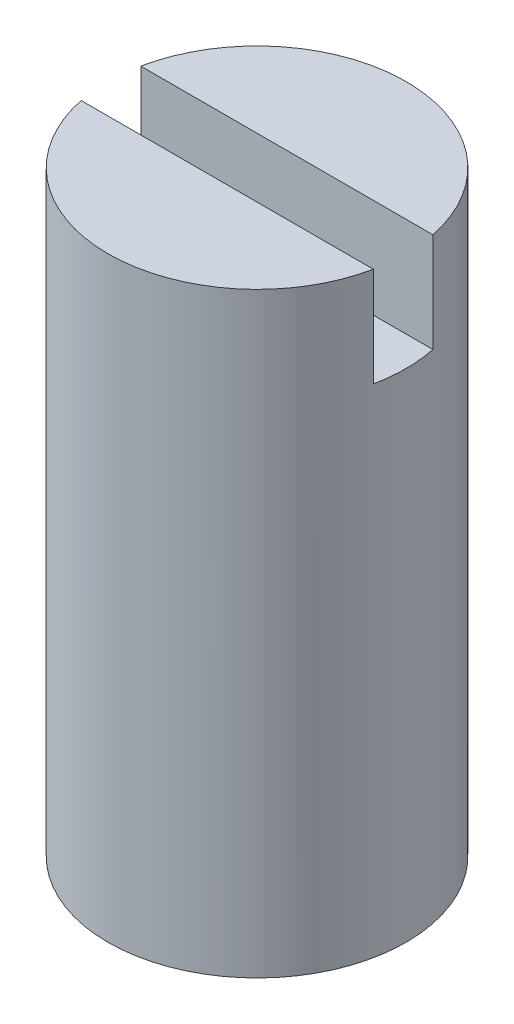
ISO-10303-21;
HEADER;
FILE_DESCRIPTION(('STEP AP214'),'2;1');
FILE_NAME('part.step','',(''),(''),'','','');
FILE_SCHEMA(('AUTOMOTIVE_DESIGN { 1 0 10303 214 1 1 1 1 }'));
ENDSEC;
DATA;
#1=APPLICATION_CONTEXT('core data for automotive mechanical design processes');
#2=APPLICATION_PROTOCOL_DEFINITION('international standard','automotive_design',2000,#1);
#3=PRODUCT_CONTEXT('',#1,'mechanical');
#4=PRODUCT('Part','Part','',(#3));
#5=PRODUCT_RELATED_PRODUCT_CATEGORY('part','',(#4));
#6=PRODUCT_DEFINITION_FORMATION('','',#4);
#7=PRODUCT_DEFINITION_CONTEXT('part definition',#1,'design');
#8=PRODUCT_DEFINITION('design','',#6,#7);
#9=PRODUCT_DEFINITION_SHAPE('','',#8);
#10=(LENGTH_UNIT() NAMED_UNIT(*) SI_UNIT(.MILLI.,.METRE.));
#11=(NAMED_UNIT(*) PLANE_ANGLE_UNIT() SI_UNIT($,.RADIAN.));
#12=(NAMED_UNIT(*) SI_UNIT($,.STERADIAN.) SOLID_ANGLE_UNIT());
#13=UNCERTAINTY_MEASURE_WITH_UNIT(LENGTH_MEASURE(1.E-05),#10,'distance_accuracy_value','');
#14=(GEOMETRIC_REPRESENTATION_CONTEXT(3) GLOBAL_UNCERTAINTY_ASSIGNED_CONTEXT((#13)) GLOBAL_UNIT_ASSIGNED_CONTEXT((#10,
#11,#12)) REPRESENTATION_CONTEXT('',''));
#15=CARTESIAN_POINT('',(0.,0.,0.));
#16=DIRECTION('',(0.,0.,1.));
#17=DIRECTION('',(1.,0.,0.));
#18=AXIS2_PLACEMENT_3D('',#15,#16,#17);
#19=CARTESIAN_POINT('',(0.,0.,0.));
#20=DIRECTION('',(0.,1.,0.));
#21=DIRECTION('',(0.,0.,1.));
#22=AXIS2_PLACEMENT_3D('',#19,#20,#21);
#23=PLANE('',#22);
#24=DIRECTION('',(-1.,0.,0.));
#25=VECTOR('',#24,1.);
#26=CARTESIAN_POINT('',(0.,0.,-0.952500000000001));
#27=LINE('',#26,#25);
#28=CARTESIAN_POINT('',(4.66627796000195,0.,-0.952500000000002));
#29=VERTEX_POINT('',#28);
#30=CARTESIAN_POINT('',(-4.66627796000195,0.,-0.9525));
#31=VERTEX_POINT('',#30);
#32=EDGE_CURVE('E82',#29,#31,#27,.T.);
#33=ORIENTED_EDGE('',*,*,#32,.F.);
#34=CARTESIAN_POINT('',(0.,0.,0.));
#35=DIRECTION('',(0.,1.,0.));
#36=DIRECTION('',(0.,0.,1.));
#37=AXIS2_PLACEMENT_3D('',#34,#35,#36);
#38=CIRCLE('',#37,4.7625);
#39=EDGE_CURVE('E91',#29,#31,#38,.T.);
#40=ORIENTED_EDGE('',*,*,#39,.T.);
#41=EDGE_LOOP('',(#33,#40));
#42=FACE_BOUND('',#41,.T.);
#43=ADVANCED_FACE('F36',(#42),#23,.T.);
#44=CARTESIAN_POINT('',(0.,-19.05,0.));
#45=DIRECTION('',(0.,1.,0.));
#46=DIRECTION('',(0.,0.,1.));
#47=AXIS2_PLACEMENT_3D('',#44,#45,#46);
#48=CYLINDRICAL_SURFACE('',#47,4.7625);
#49=DIRECTION('',(0.,1.,0.));
#50=VECTOR('',#49,1.);
#51=CARTESIAN_POINT('',(-4.66627796000195,-19.05,-0.9525));
#52=LINE('',#51,#50);
#53=CARTESIAN_POINT('',(-4.66627796000195,-3.175,-0.9525));
#54=VERTEX_POINT('',#53);
#55=EDGE_CURVE('E92',#31,#54,#52,.F.);
#56=ORIENTED_EDGE('',*,*,#55,.F.);
#57=ORIENTED_EDGE('',*,*,#39,.F.);
#58=DIRECTION('',(0.,1.,0.));
#59=VECTOR('',#58,1.);
#60=CARTESIAN_POINT('',(4.66627796000195,-19.05,-0.952500000000002));
#61=LINE('',#60,#59);
#62=CARTESIAN_POINT('',(4.66627796000195,-3.175,-0.952500000000002));
#63=VERTEX_POINT('',#62);
#64=EDGE_CURVE('E88',#63,#29,#61,.T.);
#65=ORIENTED_EDGE('',*,*,#64,.F.);
#66=CARTESIAN_POINT('',(0.,-3.175,0.));
#67=DIRECTION('',(0.,-1.,0.));
#68=DIRECTION('',(0.,0.,-1.));
#69=AXIS2_PLACEMENT_3D('',#66,#67,#68);
#70=CIRCLE('',#69,4.7625);
#71=CARTESIAN_POINT('',(4.66627796000195,-3.175,0.952499999999998));
#72=VERTEX_POINT('',#71);
#73=EDGE_CURVE('E40',#72,#63,#70,.F.);
#74=ORIENTED_EDGE('',*,*,#73,.F.);
#75=DIRECTION('',(0.,1.,0.));
#76=VECTOR('',#75,1.);
#77=CARTESIAN_POINT('',(4.66627796000195,-19.05,0.952499999999998));
#78=LINE('',#77,#76);
#79=CARTESIAN_POINT('',(4.66627796000195,0.,0.952499999999998));
#80=VERTEX_POINT('',#79);
#81=EDGE_CURVE('E77',#80,#72,#78,.F.);
#82=ORIENTED_EDGE('',*,*,#81,.F.);
#83=CARTESIAN_POINT('',(-4.66627796000195,0.,0.9525));
#84=VERTEX_POINT('',#83);
#85=EDGE_CURVE('E86',#84,#80,#38,.T.);
#86=ORIENTED_EDGE('',*,*,#85,.F.);
#87=DIRECTION('',(0.,1.,0.));
#88=VECTOR('',#87,1.);
#89=CARTESIAN_POINT('',(-4.66627796000195,-19.05,0.9525));
#90=LINE('',#89,#88);
#91=CARTESIAN_POINT('',(-4.66627796000195,-3.175,0.9525));
#92=VERTEX_POINT('',#91);
#93=EDGE_CURVE('E51',#92,#84,#90,.T.);
#94=ORIENTED_EDGE('',*,*,#93,.F.);
#95=EDGE_CURVE('E11',#54,#92,#70,.F.);
#96=ORIENTED_EDGE('',*,*,#95,.F.);
#97=EDGE_LOOP('',(#56,#57,#65,#74,#82,#86,#94,#96));
#98=FACE_BOUND('',#97,.T.);
#99=CARTESIAN_POINT('',(0.,-19.05,0.));
#100=DIRECTION('',(0.,1.,0.));
#101=DIRECTION('',(0.,0.,1.));
#102=AXIS2_PLACEMENT_3D('',#99,#100,#101);
#103=CIRCLE('',#102,4.7625);
#104=CARTESIAN_POINT('',(0.,-19.05,4.7625));
#105=VERTEX_POINT('',#104);
#106=EDGE_CURVE('E83',#105,#105,#103,.T.);
#107=ORIENTED_EDGE('',*,*,#106,.T.);
#108=EDGE_LOOP('',(#107));
#109=FACE_BOUND('',#108,.T.);
#110=ADVANCED_FACE('F38',(#98,#109),#48,.T.);
#111=CARTESIAN_POINT('',(0.,-19.05,0.));
#112=DIRECTION('',(0.,1.,0.));
#113=DIRECTION('',(0.,0.,1.));
#114=AXIS2_PLACEMENT_3D('',#111,#112,#113);
#115=PLANE('',#114);
#116=CARTESIAN_POINT('',(0.,-19.05,0.));
#117=DIRECTION('',(0.,-1.,0.));
#118=DIRECTION('',(0.,0.,-1.));
#119=AXIS2_PLACEMENT_3D('',#116,#117,#118);
#120=CIRCLE('',#119,2.);
#121=CARTESIAN_POINT('',(0.,-19.05,-2.));
#122=VERTEX_POINT('',#121);
#123=EDGE_CURVE('E113',#122,#122,#120,.T.);
#124=ORIENTED_EDGE('',*,*,#123,.F.);
#125=EDGE_LOOP('',(#124));
#126=FACE_BOUND('',#125,.T.);
#127=ORIENTED_EDGE('',*,*,#106,.F.);
#128=EDGE_LOOP('',(#127));
#129=FACE_BOUND('',#128,.T.);
#130=ADVANCED_FACE('F127',(#126,#129),#115,.F.);
#131=DIRECTION('',(1.,0.,0.));
#132=VECTOR('',#131,1.);
#133=CARTESIAN_POINT('',(0.,0.,0.952499999999999));
#134=LINE('',#133,#132);
#135=EDGE_CURVE('E74',#84,#80,#134,.T.);
#136=ORIENTED_EDGE('',*,*,#135,.F.);
#137=ORIENTED_EDGE('',*,*,#85,.T.);
#138=EDGE_LOOP('',(#136,#137));
#139=FACE_BOUND('',#138,.T.);
#140=ADVANCED_FACE('F90',(#139),#23,.T.);
#141=CARTESIAN_POINT('',(4.7625,-3.175,-0.952500000000002));
#142=DIRECTION('',(0.,0.,-1.));
#143=DIRECTION('',(-1.,0.,0.));
#144=AXIS2_PLACEMENT_3D('',#141,#142,#143);
#145=PLANE('',#144);
#146=ORIENTED_EDGE('',*,*,#55,.T.);
#147=DIRECTION('',(-1.,0.,0.));
#148=VECTOR('',#147,1.);
#149=CARTESIAN_POINT('',(4.7625,-3.175,-0.952500000000002));
#150=LINE('',#149,#148);
#151=EDGE_CURVE('E103',#63,#54,#150,.T.);
#152=ORIENTED_EDGE('',*,*,#151,.F.);
#153=ORIENTED_EDGE('',*,*,#64,.T.);
#154=ORIENTED_EDGE('',*,*,#32,.T.);
#155=EDGE_LOOP('',(#146,#152,#153,#154));
#156=FACE_BOUND('',#155,.T.);
#157=ADVANCED_FACE('F105',(#156),#145,.F.);
#158=CARTESIAN_POINT('',(4.7625,-3.175,0.952499999999998));
#159=DIRECTION('',(0.,0.,1.));
#160=DIRECTION('',(1.,0.,0.));
#161=AXIS2_PLACEMENT_3D('',#158,#159,#160);
#162=PLANE('',#161);
#163=ORIENTED_EDGE('',*,*,#81,.T.);
#164=DIRECTION('',(1.,0.,0.));
#165=VECTOR('',#164,1.);
#166=CARTESIAN_POINT('',(4.7625,-3.175,0.952499999999998));
#167=LINE('',#166,#165);
#168=EDGE_CURVE('E104',#92,#72,#167,.T.);
#169=ORIENTED_EDGE('',*,*,#168,.F.);
#170=ORIENTED_EDGE('',*,*,#93,.T.);
#171=ORIENTED_EDGE('',*,*,#135,.T.);
#172=EDGE_LOOP('',(#163,#169,#170,#171));
#173=FACE_BOUND('',#172,.T.);
#174=ADVANCED_FACE('F76',(#173),#162,.F.);
#175=CARTESIAN_POINT('',(0.,-3.175,0.));
#176=DIRECTION('',(0.,-1.,0.));
#177=DIRECTION('',(0.,0.,-1.));
#178=AXIS2_PLACEMENT_3D('',#175,#176,#177);
#179=PLANE('',#178);
#180=ORIENTED_EDGE('',*,*,#151,.T.);
#181=ORIENTED_EDGE('',*,*,#95,.T.);
#182=ORIENTED_EDGE('',*,*,#168,.T.);
#183=ORIENTED_EDGE('',*,*,#73,.T.);
#184=EDGE_LOOP('',(#180,#181,#182,#183));
#185=FACE_BOUND('',#184,.T.);
#186=ADVANCED_FACE('F102',(#185),#179,.F.);
#187=CARTESIAN_POINT('',(0.,-11.05,0.));
#188=DIRECTION('',(0.,-1.,0.));
#189=DIRECTION('',(0.,0.,-1.));
#190=AXIS2_PLACEMENT_3D('',#187,#188,#189);
#191=CYLINDRICAL_SURFACE('',#190,2.);
#192=CARTESIAN_POINT('',(0.,-11.05,0.));
#193=DIRECTION('',(0.,-1.,0.));
#194=DIRECTION('',(0.,0.,-1.));
#195=AXIS2_PLACEMENT_3D('',#192,#193,#194);
#196=CIRCLE('',#195,2.);
#197=CARTESIAN_POINT('',(0.,-11.05,-2.));
#198=VERTEX_POINT('',#197);
#199=EDGE_CURVE('E112',#198,#198,#196,.T.);
#200=ORIENTED_EDGE('',*,*,#199,.F.);
#201=EDGE_LOOP('',(#200));
#202=FACE_BOUND('',#201,.T.);
#203=ORIENTED_EDGE('',*,*,#123,.T.);
#204=EDGE_LOOP('',(#203));
#205=FACE_BOUND('',#204,.T.);
#206=ADVANCED_FACE('F121',(#202,#205),#191,.F.);
#207=CARTESIAN_POINT('',(0.,-11.05,0.));
#208=DIRECTION('',(0.,-1.,0.));
#209=DIRECTION('',(0.,0.,-1.));
#210=AXIS2_PLACEMENT_3D('',#207,#208,#209);
#211=PLANE('',#210);
#212=ORIENTED_EDGE('',*,*,#199,.T.);
#213=EDGE_LOOP('',(#212));
#214=FACE_BOUND('',#213,.T.);
#215=ADVANCED_FACE('F119',(#214),#211,.T.);
#216=CLOSED_SHELL('',(#43,#110,#130,#140,#157,#174,#186,#206,#215));
#217=MANIFOLD_SOLID_BREP('B2',#216);
#218=ADVANCED_BREP_SHAPE_REPRESENTATION('',(#18,#217),#14);
#219=SHAPE_DEFINITION_REPRESENTATION(#9,#218);
ENDSEC;
END-ISO-10303-21;
